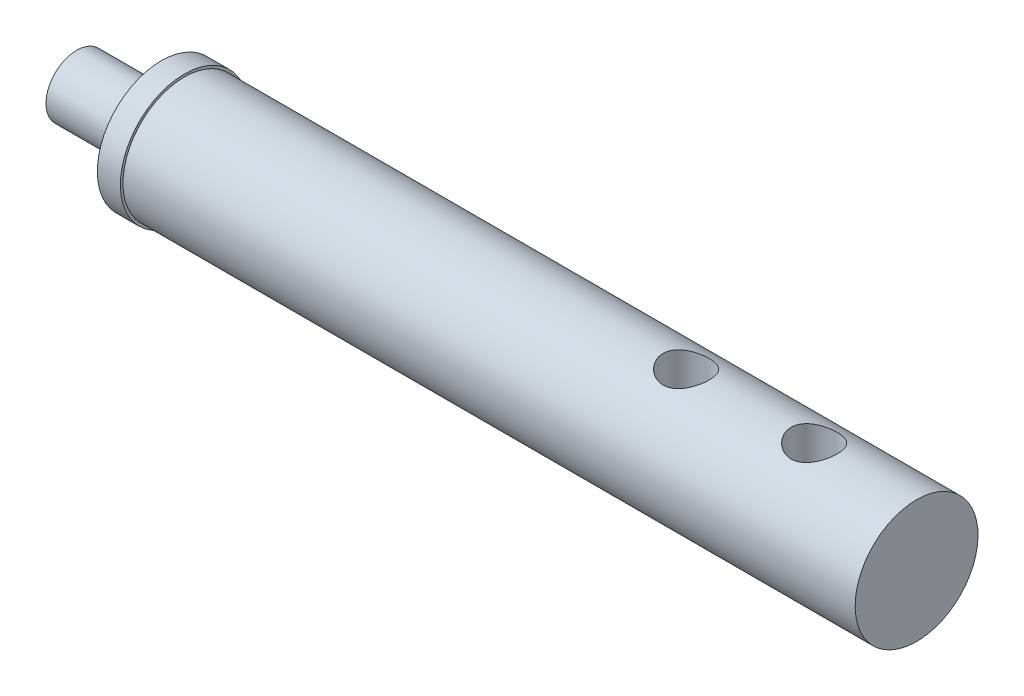
ISO-10303-21;
HEADER;
FILE_DESCRIPTION(('STEP AP214'),'2;1');
FILE_NAME('part.step','',(''),(''),'','','');
FILE_SCHEMA(('AUTOMOTIVE_DESIGN { 1 0 10303 214 1 1 1 1 }'));
ENDSEC;
DATA;
#1=APPLICATION_CONTEXT('core data for automotive mechanical design processes');
#2=APPLICATION_PROTOCOL_DEFINITION('international standard','automotive_design',2000,#1);
#3=PRODUCT_CONTEXT('',#1,'mechanical');
#4=PRODUCT('Part','Part','',(#3));
#5=PRODUCT_RELATED_PRODUCT_CATEGORY('part','',(#4));
#6=PRODUCT_DEFINITION_FORMATION('','',#4);
#7=PRODUCT_DEFINITION_CONTEXT('part definition',#1,'design');
#8=PRODUCT_DEFINITION('design','',#6,#7);
#9=PRODUCT_DEFINITION_SHAPE('','',#8);
#10=(LENGTH_UNIT() NAMED_UNIT(*) SI_UNIT(.MILLI.,.METRE.));
#11=(NAMED_UNIT(*) PLANE_ANGLE_UNIT() SI_UNIT($,.RADIAN.));
#12=(NAMED_UNIT(*) SI_UNIT($,.STERADIAN.) SOLID_ANGLE_UNIT());
#13=UNCERTAINTY_MEASURE_WITH_UNIT(LENGTH_MEASURE(1.E-05),#10,'distance_accuracy_value','');
#14=(GEOMETRIC_REPRESENTATION_CONTEXT(3) GLOBAL_UNCERTAINTY_ASSIGNED_CONTEXT((#13)) GLOBAL_UNIT_ASSIGNED_CONTEXT((#10,
#11,#12)) REPRESENTATION_CONTEXT('',''));
#15=CARTESIAN_POINT('',(0.,0.,0.));
#16=DIRECTION('',(0.,0.,1.));
#17=DIRECTION('',(1.,0.,0.));
#18=AXIS2_PLACEMENT_3D('',#15,#16,#17);
#19=CARTESIAN_POINT('',(108.677085229247,0.,0.));
#20=DIRECTION('',(1.,0.,0.));
#21=DIRECTION('',(0.,1.,0.));
#22=AXIS2_PLACEMENT_3D('',#19,#20,#21);
#23=PLANE('',#22);
#24=CARTESIAN_POINT('',(108.677085229247,0.,0.));
#25=DIRECTION('',(1.,0.,0.));
#26=DIRECTION('',(0.,1.,0.));
#27=AXIS2_PLACEMENT_3D('',#24,#25,#26);
#28=CIRCLE('',#27,12.);
#29=CARTESIAN_POINT('',(108.677085229247,12.,0.));
#30=VERTEX_POINT('',#29);
#31=EDGE_CURVE('E10',#30,#30,#28,.T.);
#32=ORIENTED_EDGE('',*,*,#31,.T.);
#33=EDGE_LOOP('',(#32));
#34=FACE_BOUND('',#33,.T.);
#35=ADVANCED_FACE('F33',(#34),#23,.T.);
#36=CARTESIAN_POINT('',(108.677085229247,0.,0.));
#37=DIRECTION('',(1.,0.,0.));
#38=DIRECTION('',(0.,1.,0.));
#39=AXIS2_PLACEMENT_3D('',#36,#37,#38);
#40=CYLINDRICAL_SURFACE('',#39,12.);
#41=CARTESIAN_POINT('',(84.1770852292475,12.,0.));
#42=CARTESIAN_POINT('',(84.1770846666589,12.0000004149463,0.121821920216143));
#43=CARTESIAN_POINT('',(84.1820358647094,11.9981409348073,0.243636002691336));
#44=CARTESIAN_POINT('',(84.2017913173601,11.990753547771,0.486392423781215));
#45=CARTESIAN_POINT('',(84.2165987219613,11.9852244680872,0.607334471202251));
#46=CARTESIAN_POINT('',(84.255910815812,11.970649565472,0.847347381687187));
#47=CARTESIAN_POINT('',(84.2804103467286,11.9616056132673,0.966419205128135));
#48=CARTESIAN_POINT('',(84.3388794686573,11.9402382455255,1.2019581040135));
#49=CARTESIAN_POINT('',(84.3728527388007,11.9279135559973,1.31842414848255));
#50=CARTESIAN_POINT('',(84.4498703792966,11.9003384511568,1.54765442429004));
#51=CARTESIAN_POINT('',(84.4928931782499,11.8850950009216,1.66042673449101));
#52=CARTESIAN_POINT('',(84.587691264291,11.8520536393113,1.8818570560588));
#53=CARTESIAN_POINT('',(84.6394697967652,11.8342547811235,1.99051352350809));
#54=CARTESIAN_POINT('',(84.807353634791,11.7776768093622,2.30927279411985));
#55=CARTESIAN_POINT('',(84.9360670253792,11.7356939966761,2.51234231941558));
#56=CARTESIAN_POINT('',(85.2289285958481,11.6455850212357,2.90206977477989));
#57=CARTESIAN_POINT('',(85.3942447512558,11.5972851945296,3.08780172063124));
#58=CARTESIAN_POINT('',(85.7533478075454,11.500801507554,3.42974311725174));
#59=CARTESIAN_POINT('',(85.9471433908212,11.4526176872201,3.58594353155376));
#60=CARTESIAN_POINT('',(86.2595261584191,11.3834841407686,3.79764477617943));
#61=CARTESIAN_POINT('',(86.3695226129936,11.3605705131175,3.86547493196533));
#62=CARTESIAN_POINT('',(86.5952537172002,11.3168804194774,3.99157408188853));
#63=CARTESIAN_POINT('',(86.7109860415758,11.2961030977882,4.04984690983613));
#64=CARTESIAN_POINT('',(86.9474509866362,11.257354412399,4.15634309619241));
#65=CARTESIAN_POINT('',(87.0681841903026,11.2393833770156,4.20456527896395));
#66=CARTESIAN_POINT('',(87.3137342752707,11.2068698048304,4.29047551547082));
#67=CARTESIAN_POINT('',(87.4385491542987,11.1923256148824,4.32816865016452));
#68=CARTESIAN_POINT('',(87.6862209467612,11.167687799886,4.39133833063888));
#69=CARTESIAN_POINT('',(87.8089516546886,11.1574374723367,4.41724869222399));
#70=CARTESIAN_POINT('',(88.0563603436103,11.1409189584307,4.45874705417234));
#71=CARTESIAN_POINT('',(88.1810374485606,11.1346490306496,4.4743395687192));
#72=CARTESIAN_POINT('',(88.4313813249436,11.1263077224061,4.4950419282572));
#73=CARTESIAN_POINT('',(88.5570479454543,11.124235713664,4.50015334189903));
#74=CARTESIAN_POINT('',(88.8083613306208,11.124362586323,4.49983964081548));
#75=CARTESIAN_POINT('',(88.9340080958579,11.1265613020677,4.49441493477358));
#76=CARTESIAN_POINT('',(89.1767396457381,11.1348931002806,4.4737313818125));
#77=CARTESIAN_POINT('',(89.2938850540955,11.1407817124042,4.4590833434736));
#78=CARTESIAN_POINT('',(89.5264534934787,11.1560711786316,4.42068867776496));
#79=CARTESIAN_POINT('',(89.6418759391447,11.1654731993557,4.39693902815623));
#80=CARTESIAN_POINT('',(89.984314246136,11.1985472030748,4.31234407385654));
#81=CARTESIAN_POINT('',(90.2077139490268,11.2270952052095,4.23813423625875));
#82=CARTESIAN_POINT('',(90.6429529098014,11.294571324263,4.05490721343477));
#83=CARTESIAN_POINT('',(90.854493484467,11.3336856090865,3.94525805379046));
#84=CARTESIAN_POINT('',(91.2569126417782,11.417826234714,3.6946836216903));
#85=CARTESIAN_POINT('',(91.4477840566549,11.4628546145386,3.55374755073012));
#86=CARTESIAN_POINT('',(91.8168991071582,11.5574411862383,3.23345300799872));
#87=CARTESIAN_POINT('',(91.9934319255671,11.607100429164,3.05214885027355));
#88=CARTESIAN_POINT('',(92.3140983536707,11.7027518394278,2.66193788370925));
#89=CARTESIAN_POINT('',(92.4582269838947,11.748743442469,2.45302684040981));
#90=CARTESIAN_POINT('',(92.7118766328393,11.8327918458052,2.00917028059688));
#91=CARTESIAN_POINT('',(92.8208280307739,11.8707149483013,1.77387213379261));
#92=CARTESIAN_POINT('',(92.9970329842201,11.9333615492963,1.28651055931184));
#93=CARTESIAN_POINT('',(93.0643050598478,11.9580909097264,1.03445463312944));
#94=CARTESIAN_POINT('',(93.1519536099419,11.9905332973328,0.535125728885332));
#95=CARTESIAN_POINT('',(93.1746330668968,11.9990810722223,0.288310863440803));
#96=CARTESIAN_POINT('',(93.1791584024495,12.0007768095524,-0.2057174305182));
#97=CARTESIAN_POINT('',(93.1610133342757,11.9939281862917,-0.452930758520921));
#98=CARTESIAN_POINT('',(93.0861551560948,11.9661512982893,-0.930786126866774));
#99=CARTESIAN_POINT('',(93.0309507918936,11.9457741475744,-1.16169991458787));
#100=CARTESIAN_POINT('',(92.885526817723,11.8935442940438,-1.61082533431484));
#101=CARTESIAN_POINT('',(92.79530265361,11.8616900987367,-1.82903531000967));
#102=CARTESIAN_POINT('',(92.5795267349307,11.7884888040033,-2.25374302875422));
#103=CARTESIAN_POINT('',(92.4530148518034,11.7468902777666,-2.4597082422869));
#104=CARTESIAN_POINT('',(92.1693281084677,11.6587998753534,-2.8481791439392));
#105=CARTESIAN_POINT('',(92.0121419280239,11.6123061955644,-3.03067612982122));
#106=CARTESIAN_POINT('',(91.6608839758617,11.516200958323,-3.37808840855272));
#107=CARTESIAN_POINT('',(91.4652012754506,11.4665650100461,-3.54136933947526));
#108=CARTESIAN_POINT('',(91.0480884767801,11.372360357102,-3.83314678656077));
#109=CARTESIAN_POINT('',(90.826656069039,11.3277921076647,-3.96164017919753));
#110=CARTESIAN_POINT('',(90.4791624328501,11.2687303690453,-4.12541953452073));
#111=CARTESIAN_POINT('',(90.3604378996616,11.2503030894951,-4.17527938653556));
#112=CARTESIAN_POINT('',(90.1187613841315,11.2166905930926,-4.2647558541672));
#113=CARTESIAN_POINT('',(89.9958112254935,11.2015039975232,-4.30437682733459));
#114=CARTESIAN_POINT('',(89.7466187571431,11.1749073223601,-4.37296242168503));
#115=CARTESIAN_POINT('',(89.620377448834,11.163496108165,-4.40193024471252));
#116=CARTESIAN_POINT('',(89.3655670896572,11.1448585297206,-4.44890662829909));
#117=CARTESIAN_POINT('',(89.2369982017811,11.1376318736025,-4.46691595320736));
#118=CARTESIAN_POINT('',(88.9869468910608,11.1279568107625,-4.49096111754738));
#119=CARTESIAN_POINT('',(88.8655417134995,11.1252304971503,-4.49769375768258));
#120=CARTESIAN_POINT('',(88.6225169298441,11.1237678185175,-4.50131029580416));
#121=CARTESIAN_POINT('',(88.5008972652511,11.1250327991546,-4.49819087218449));
#122=CARTESIAN_POINT('',(88.2584734507649,11.131512007523,-4.48213280066957));
#123=CARTESIAN_POINT('',(88.1376689438313,11.1367243753675,-4.46919877710469));
#124=CARTESIAN_POINT('',(87.8976751281152,11.150924738849,-4.43364891145918));
#125=CARTESIAN_POINT('',(87.7784864449857,11.1599141561698,-4.41102942370236));
#126=CARTESIAN_POINT('',(87.5462737226528,11.1810458214159,-4.35718066722753));
#127=CARTESIAN_POINT('',(87.4331730899701,11.1930817833517,-4.32623979458418));
#128=CARTESIAN_POINT('',(87.2100289573492,11.220069483486,-4.2557559108144));
#129=CARTESIAN_POINT('',(87.0999865439142,11.23502224319,-4.21620988547497));
#130=CARTESIAN_POINT('',(86.7754897236352,11.2836374066331,-4.08512625929656));
#131=CARTESIAN_POINT('',(86.5664924120514,11.3210734609741,-3.98110253179985));
#132=CARTESIAN_POINT('',(86.1575753429247,11.4041928736043,-3.73655960136616));
#133=CARTESIAN_POINT('',(85.9587057154186,11.4502056852775,-3.59441315608529));
#134=CARTESIAN_POINT('',(85.5866476656644,11.5441926723435,-3.28000639093492));
#135=CARTESIAN_POINT('',(85.4134674379855,11.5921674673836,-3.10773650011228));
#136=CARTESIAN_POINT('',(85.1718393533,11.6632064644303,-2.82485495768735));
#137=CARTESIAN_POINT('',(85.0925612443134,11.6873329442322,-2.72355677041138));
#138=CARTESIAN_POINT('',(84.9428309077527,11.7341212355869,-2.51433251035988));
#139=CARTESIAN_POINT('',(84.8723754517559,11.7567835814237,-2.40640888366375));
#140=CARTESIAN_POINT('',(84.7407910951397,11.8000231112314,-2.18454509687346));
#141=CARTESIAN_POINT('',(84.6796671663781,11.8205991816831,-2.07060177268688));
#142=CARTESIAN_POINT('',(84.5673252356413,11.8590616275344,-1.83755175113715));
#143=CARTESIAN_POINT('',(84.5161030262077,11.8769491446375,-1.71844727331544));
#144=CARTESIAN_POINT('',(84.4219872644552,11.9102407175975,-1.47053797162899));
#145=CARTESIAN_POINT('',(84.3795583909248,11.9255011706843,-1.34153686175288));
#146=CARTESIAN_POINT('',(84.3064722661196,11.9520331999051,-1.07989915577461));
#147=CARTESIAN_POINT('',(84.2758098579,11.9633065233272,-0.947264179674937));
#148=CARTESIAN_POINT('',(84.2266001691643,11.9814979813589,-0.679492491904569));
#149=CARTESIAN_POINT('',(84.2080507499299,11.9884168847946,-0.544356226207061));
#150=CARTESIAN_POINT('',(84.1832942909703,11.9976674031164,-0.272809934790544));
#151=CARTESIAN_POINT('',(84.1770858591598,11.9999995353981,-0.136400054481796));
#152=CARTESIAN_POINT('',(84.1770852292475,12.,0.));
#153=B_SPLINE_CURVE_WITH_KNOTS('',3,(#41,#42,#43,#44,#45,#46,#47,#48,#49,#50,#51,#52,#53,#54,
#55,#56,#57,#58,#59,#60,#61,#62,#63,#64,#65,#66,#67,#68,#69,#70,#71,#72,#73,#74,#75,#76,#77,#78,
#79,#80,#81,#82,#83,#84,#85,#86,#87,#88,#89,#90,#91,#92,#93,#94,#95,#96,#97,#98,#99,#100,#101,
#102,#103,#104,#105,#106,#107,#108,#109,#110,#111,#112,#113,#114,#115,#116,#117,#118,#119,#120,
#121,#122,#123,#124,#125,#126,#127,#128,#129,#130,#131,#132,#133,#134,#135,#136,#137,#138,#139,
#140,#141,#142,#143,#144,#145,#146,#147,#148,#149,#150,#151,#152),.UNSPECIFIED.,.T.,.F.,(4,2,2,
2,2,2,2,2,2,2,2,2,2,2,2,2,2,2,2,2,2,2,2,2,2,2,2,2,2,2,2,2,2,2,2,2,2,2,2,2,2,2,2,2,2,2,2,2,2,2,2,
2,2,2,2,4),(0.,0.36533802450695,0.730792865566522,1.09605346575198,1.46145611308565,
1.82599742407275,2.19067415273862,2.91947018392637,3.67616860257936,4.43309819286654,
4.8264268137856,5.21959726757256,5.61281368524463,6.00584002102325,6.38291145568131,
6.75981780772968,7.13666774608802,7.51350306718044,7.86768402280121,8.22198268815951,
8.92994647641828,9.65130458621117,10.3729120569283,11.143016934675,11.9132400717526,
12.6953735931829,13.477159325566,14.2173829236784,14.9574423863162,15.6690654723158,
16.3807811322342,17.1134089903886,17.8463077351966,18.6217279182703,19.3972177022048,
19.7870381951625,20.1766925107004,20.566229618268,20.9557395527224,21.3201489316713,
21.6846811837186,22.0490417862153,22.413539657309,22.7667469946613,23.1200782532195,
23.8262105801187,24.5693581369516,25.3127422403353,25.7049754844992,26.0970647789656,
26.4893622558026,26.881492668616,27.2908478409865,27.7000233978562,28.1091266894862,
28.5181838309153),.UNSPECIFIED.);
#154=CARTESIAN_POINT('',(84.1770852292475,12.,0.));
#155=VERTEX_POINT('',#154);
#156=EDGE_CURVE('E36',#155,#155,#153,.T.);
#157=ORIENTED_EDGE('',*,*,#156,.F.);
#158=EDGE_LOOP('',(#157));
#159=FACE_BOUND('',#158,.T.);
#160=CARTESIAN_POINT('',(88.6770852292475,-11.1242977306435,4.49999999999999));
#161=CARTESIAN_POINT('',(88.5556043790945,-11.1242972328958,4.50000051486866));
#162=CARTESIAN_POINT('',(88.4341312987894,-11.1262931123941,4.49507656344739));
#163=CARTESIAN_POINT('',(88.1920683954553,-11.1342087111622,4.47543393307325));
#164=CARTESIAN_POINT('',(88.0714788713279,-11.1401297014426,4.46071208140507));
#165=CARTESIAN_POINT('',(87.8321671996392,-11.1556999756688,4.4216287704631));
#166=CARTESIAN_POINT('',(87.7134442664983,-11.1653476449693,4.39727148579009));
#167=CARTESIAN_POINT('',(87.4786369752881,-11.1880554461943,4.339167733839));
#168=CARTESIAN_POINT('',(87.3625536815015,-11.2011169289245,4.30541754955758));
#169=CARTESIAN_POINT('',(87.0201055963718,-11.244759464982,4.19072103949293));
#170=CARTESIAN_POINT('',(86.7986983725318,-11.2798579603423,4.09618882137095));
#171=CARTESIAN_POINT('',(86.3749302137349,-11.3580953533323,3.87394729637414));
#172=CARTESIAN_POINT('',(86.1725750245819,-11.4012366649375,3.74622802417441));
#173=CARTESIAN_POINT('',(85.7824255342208,-11.4931068606514,3.45440224379134));
#174=CARTESIAN_POINT('',(85.5957026556954,-11.5420001559471,3.28891208094076));
#175=CARTESIAN_POINT('',(85.2519137692546,-11.6384926206391,2.92918687465789));
#176=CARTESIAN_POINT('',(85.0948540874544,-11.6860915121359,2.73494571537004));
#177=CARTESIAN_POINT('',(84.8096675408499,-11.7765861894619,2.31508414690118));
#178=CARTESIAN_POINT('',(84.6827070320791,-11.8192668290451,2.08862089113191));
#179=CARTESIAN_POINT('',(84.4691314847724,-11.8931402468728,1.61566726739477));
#180=CARTESIAN_POINT('',(84.3825024537277,-11.9243370085197,1.36918388007284));
#181=CARTESIAN_POINT('',(84.2558115988992,-11.9705609111804,0.87446803720928));
#182=CARTESIAN_POINT('',(84.2139023621646,-11.9862274559289,0.626769595102087));
#183=CARTESIAN_POINT('',(84.171921611179,-12.0019204237524,0.127393088128116));
#184=CARTESIAN_POINT('',(84.1718364924057,-12.0019519325818,-0.12428365604048));
#185=CARTESIAN_POINT('',(84.2124305174315,-11.9867779769887,-0.611230628383599));
#186=CARTESIAN_POINT('',(84.2510931241095,-11.9723262598653,-0.846696534583528));
#187=CARTESIAN_POINT('',(84.3646929739085,-11.9307982480031,-1.30751765417036));
#188=CARTESIAN_POINT('',(84.43963278576,-11.9037210592799,-1.53287215034972));
#189=CARTESIAN_POINT('',(84.6245965845526,-11.8391330750131,-1.97096705184962));
#190=CARTESIAN_POINT('',(84.7351152451258,-11.801476184087,-2.183476176845));
#191=CARTESIAN_POINT('',(84.9876615199625,-11.7195393067737,-2.5874598238896));
#192=CARTESIAN_POINT('',(85.1296992982855,-11.6752571854336,-2.77892753080496));
#193=CARTESIAN_POINT('',(85.4509670881127,-11.5815758896233,-3.14727146039434));
#194=CARTESIAN_POINT('',(85.6318869761813,-11.5320289127229,-3.32263843577455));
#195=CARTESIAN_POINT('',(86.0208642092297,-11.4354738195653,-3.64111186709615));
#196=CARTESIAN_POINT('',(86.2289283490931,-11.3884663431889,-3.78421022084207));
#197=CARTESIAN_POINT('',(86.6722436315652,-11.3013811042672,-4.03696835419777));
#198=CARTESIAN_POINT('',(86.9079957100051,-11.2614803117135,-4.14581543536005));
#199=CARTESIAN_POINT('',(87.3963739044387,-11.1951731560847,-4.3216939330478));
#200=CARTESIAN_POINT('',(87.648990543936,-11.1687592854473,-4.38874861811552));
#201=CARTESIAN_POINT('',(88.1490131162608,-11.1341879173731,-4.47570575133563));
#202=CARTESIAN_POINT('',(88.3959375458733,-11.12510355743,-4.49800563478112));
#203=CARTESIAN_POINT('',(88.8901132994553,-11.1235961855666,-4.501736569076));
#204=CARTESIAN_POINT('',(89.1373645263007,-11.1311690100715,-4.48317783280982));
#205=CARTESIAN_POINT('',(89.6128749961146,-11.1611814489379,-4.40789200560757));
#206=CARTESIAN_POINT('',(89.8414786365414,-11.1828982865056,-4.35301855002693));
#207=CARTESIAN_POINT('',(90.2861290634082,-11.2378946113787,-4.2089932392189));
#208=CARTESIAN_POINT('',(90.5021732667562,-11.2711764675025,-4.11983436104071));
#209=CARTESIAN_POINT('',(90.9245785434717,-11.3470872934852,-3.90600876825621));
#210=CARTESIAN_POINT('',(91.1302731056415,-11.3900198667602,-3.78013635530255));
#211=CARTESIAN_POINT('',(91.5184721744437,-11.4798844288305,-3.4977395358832));
#212=CARTESIAN_POINT('',(91.7009681531893,-11.5268178778321,-3.34120391092628));
#213=CARTESIAN_POINT('',(92.0495903487606,-11.6229913965851,-2.99018202266745));
#214=CARTESIAN_POINT('',(92.2139454552764,-11.67218908067,-2.79391902433725));
#215=CARTESIAN_POINT('',(92.5076003322932,-11.7644962489399,-2.37539241539538));
#216=CARTESIAN_POINT('',(92.6368999891222,-11.807605713383,-2.15312872047637));
#217=CARTESIAN_POINT('',(92.8559233968127,-11.882849570984,-1.68904898789882));
#218=CARTESIAN_POINT('',(92.9457825967735,-11.9150214395717,-1.44730329730598));
#219=CARTESIAN_POINT('',(93.0830544746472,-11.9648831019454,-0.950645664456751));
#220=CARTESIAN_POINT('',(93.1304870998783,-11.9825797011027,-0.695739969210863));
#221=CARTESIAN_POINT('',(93.1794084239854,-12.0008522175155,-0.196006749191646));
#222=CARTESIAN_POINT('',(93.1834136293093,-12.0023658213628,0.0485423282554951));
#223=CARTESIAN_POINT('',(93.1518398000205,-11.9905467015259,0.534680335167223));
#224=CARTESIAN_POINT('',(93.1162655394917,-11.9772157683929,0.776269618089571));
#225=CARTESIAN_POINT('',(93.0083084963268,-11.9376326617728,1.2436448325906));
#226=CARTESIAN_POINT('',(92.936844853302,-11.9117036441642,1.46967251586619));
#227=CARTESIAN_POINT('',(92.7600558475295,-11.8496336058244,1.90654609629838));
#228=CARTESIAN_POINT('',(92.6547240748157,-11.8134906521352,2.1173891103136));
#229=CARTESIAN_POINT('',(92.408140840031,-11.7327181713002,2.52762178508753));
#230=CARTESIAN_POINT('',(92.2655655727351,-11.6877957662403,2.72615741797057));
#231=CARTESIAN_POINT('',(91.9506714771354,-11.5949866683837,3.09724726943399));
#232=CARTESIAN_POINT('',(91.7783420320587,-11.5470989214303,3.26979217281129));
#233=CARTESIAN_POINT('',(91.3978545129118,-11.4506382353735,3.59345520966895));
#234=CARTESIAN_POINT('',(91.1882854856055,-11.4021625294342,3.74296181718829));
#235=CARTESIAN_POINT('',(90.8564361718651,-11.3352443002644,3.93916546426689));
#236=CARTESIAN_POINT('',(90.742826150075,-11.3138924119309,3.99992025047125));
#237=CARTESIAN_POINT('',(90.5104562211858,-11.273782848917,4.11161020403325));
#238=CARTESIAN_POINT('',(90.391698539956,-11.2550240673794,4.16254956474638));
#239=CARTESIAN_POINT('',(90.1444488611835,-11.2199608933438,4.25618289786881));
#240=CARTESIAN_POINT('',(90.0157588381115,-11.2038027773365,4.29840935950535));
#241=CARTESIAN_POINT('',(89.7547256255342,-11.1756202127792,4.37115963992764));
#242=CARTESIAN_POINT('',(89.6223841068396,-11.163593906448,4.40168871890875));
#243=CARTESIAN_POINT('',(89.3551927352085,-11.1441502260957,4.45068676541731));
#244=CARTESIAN_POINT('',(89.2203436805032,-11.1367314103777,4.46915950549961));
#245=CARTESIAN_POINT('',(88.949354805972,-11.1268057292739,4.49381511438351));
#246=CARTESIAN_POINT('',(88.8132151392481,-11.1242982884133,4.49999942304464));
#247=CARTESIAN_POINT('',(88.6770852292475,-11.1242977306435,4.49999999999999));
#248=B_SPLINE_CURVE_WITH_KNOTS('',3,(#160,#161,#162,#163,#164,#165,#166,#167,#168,#169,#170,
#171,#172,#173,#174,#175,#176,#177,#178,#179,#180,#181,#182,#183,#184,#185,#186,#187,#188,#189,
#190,#191,#192,#193,#194,#195,#196,#197,#198,#199,#200,#201,#202,#203,#204,#205,#206,#207,#208,
#209,#210,#211,#212,#213,#214,#215,#216,#217,#218,#219,#220,#221,#222,#223,#224,#225,#226,#227,
#228,#229,#230,#231,#232,#233,#234,#235,#236,#237,#238,#239,#240,#241,#242,#243,#244,#245,#246,
#247),.UNSPECIFIED.,.T.,.F.,(4,2,2,2,2,2,2,2,2,2,2,2,2,2,2,2,2,2,2,2,2,2,2,2,2,2,2,2,2,2,2,2,2,
2,2,2,2,2,2,2,2,2,2,4),(0.,0.364312890801975,0.728743809325302,1.0930170089067,1.45743456590096,
2.1837286923755,2.91024116115319,3.66958869413822,4.42909798679386,5.21445128619701,
5.99953191354428,6.75074967679475,7.5017230842501,8.2155433062002,8.92941408000443,
9.65367305842441,10.3781659309736,11.1450493740806,11.9121251569244,12.6962268897519,
13.4798916712983,14.2203188544486,14.9605609839006,15.66566450008,16.3709125251198,
17.1025959524087,17.8345475762247,18.6128996320427,19.3912542117394,20.1669143889391,
20.9422096890378,21.6723207387321,22.4023437318184,23.1145573423507,23.8269058276189,
24.5691988325436,25.3117572490829,26.0935071084964,26.4848788226902,26.8760829621587,
27.2846870621149,27.6931072006589,28.1013994789094,28.5096439139333),.UNSPECIFIED.);
#249=CARTESIAN_POINT('',(88.6770852292475,-11.1242977306435,4.49999999999999));
#250=VERTEX_POINT('',#249);
#251=EDGE_CURVE('E134',#250,#250,#248,.T.);
#252=ORIENTED_EDGE('',*,*,#251,.F.);
#253=EDGE_LOOP('',(#252));
#254=FACE_BOUND('',#253,.T.);
#255=CARTESIAN_POINT('',(59.1770852292475,12.,0.));
#256=CARTESIAN_POINT('',(59.1770846666589,12.0000004149463,0.121821920216143));
#257=CARTESIAN_POINT('',(59.1820358647094,11.9981409348073,0.243636002691336));
#258=CARTESIAN_POINT('',(59.2017913173601,11.990753547771,0.486392423781215));
#259=CARTESIAN_POINT('',(59.2165987219613,11.9852244680872,0.607334471202252));
#260=CARTESIAN_POINT('',(59.255910815812,11.970649565472,0.847347381687187));
#261=CARTESIAN_POINT('',(59.2804103467286,11.9616056132673,0.966419205128133));
#262=CARTESIAN_POINT('',(59.3388794686573,11.9402382455255,1.2019581040135));
#263=CARTESIAN_POINT('',(59.3728527388007,11.9279135559973,1.31842414848255));
#264=CARTESIAN_POINT('',(59.4498703792966,11.9003384511568,1.54765442429004));
#265=CARTESIAN_POINT('',(59.4928931782499,11.8850950009216,1.66042673449101));
#266=CARTESIAN_POINT('',(59.587691264291,11.8520536393113,1.88185705605879));
#267=CARTESIAN_POINT('',(59.6394697967652,11.8342547811235,1.99051352350808));
#268=CARTESIAN_POINT('',(59.8073536347909,11.7776768093622,2.30927279411985));
#269=CARTESIAN_POINT('',(59.9360670253791,11.7356939966761,2.51234231941558));
#270=CARTESIAN_POINT('',(60.2289285958481,11.6455850212357,2.90206977477989));
#271=CARTESIAN_POINT('',(60.3942447512557,11.5972851945296,3.08780172063125));
#272=CARTESIAN_POINT('',(60.7533478075454,11.5008015075539,3.42974311725175));
#273=CARTESIAN_POINT('',(60.9471433908212,11.4526176872201,3.58594353155377));
#274=CARTESIAN_POINT('',(61.2595261584191,11.3834841407686,3.79764477617944));
#275=CARTESIAN_POINT('',(61.3695226129936,11.3605705131175,3.86547493196535));
#276=CARTESIAN_POINT('',(61.5952537172002,11.3168804194774,3.99157408188854));
#277=CARTESIAN_POINT('',(61.7109860415758,11.2961030977882,4.04984690983615));
#278=CARTESIAN_POINT('',(61.9474509866362,11.257354412399,4.15634309619243));
#279=CARTESIAN_POINT('',(62.0681841903026,11.2393833770156,4.20456527896396));
#280=CARTESIAN_POINT('',(62.3137342752707,11.2068698048304,4.29047551547084));
#281=CARTESIAN_POINT('',(62.4385491542987,11.1923256148824,4.32816865016453));
#282=CARTESIAN_POINT('',(62.6862209467612,11.167687799886,4.39133833063889));
#283=CARTESIAN_POINT('',(62.8089516546886,11.1574374723367,4.417248692224));
#284=CARTESIAN_POINT('',(63.0563603436103,11.1409189584307,4.45874705417235));
#285=CARTESIAN_POINT('',(63.1810374485606,11.1346490306496,4.47433956871922));
#286=CARTESIAN_POINT('',(63.4313813249437,11.1263077224061,4.49504192825721));
#287=CARTESIAN_POINT('',(63.5570479454543,11.124235713664,4.50015334189904));
#288=CARTESIAN_POINT('',(63.8083613306208,11.124362586323,4.4998396408155));
#289=CARTESIAN_POINT('',(63.9340080958579,11.1265613020677,4.49441493477359));
#290=CARTESIAN_POINT('',(64.1767396457381,11.1348931002806,4.47373138181252));
#291=CARTESIAN_POINT('',(64.2938850540955,11.1407817124042,4.45908334347361));
#292=CARTESIAN_POINT('',(64.5264534934787,11.1560711786316,4.42068867776497));
#293=CARTESIAN_POINT('',(64.6418759391447,11.1654731993557,4.39693902815624));
#294=CARTESIAN_POINT('',(64.984314246136,11.1985472030748,4.31234407385655));
#295=CARTESIAN_POINT('',(65.2077139490268,11.2270952052094,4.23813423625877));
#296=CARTESIAN_POINT('',(65.6429529098014,11.294571324263,4.05490721343478));
#297=CARTESIAN_POINT('',(65.854493484467,11.3336856090865,3.94525805379048));
#298=CARTESIAN_POINT('',(66.2569126417782,11.417826234714,3.69468362169032));
#299=CARTESIAN_POINT('',(66.4477840566549,11.4628546145386,3.55374755073014));
#300=CARTESIAN_POINT('',(66.8168991071582,11.5574411862383,3.23345300799872));
#301=CARTESIAN_POINT('',(66.9934319255671,11.607100429164,3.05214885027356));
#302=CARTESIAN_POINT('',(67.3140983536707,11.7027518394278,2.66193788370926));
#303=CARTESIAN_POINT('',(67.4582269838948,11.748743442469,2.45302684040983));
#304=CARTESIAN_POINT('',(67.7118766328393,11.8327918458052,2.00917028059689));
#305=CARTESIAN_POINT('',(67.8208280307739,11.8707149483013,1.77387213379262));
#306=CARTESIAN_POINT('',(67.9970329842202,11.9333615492963,1.28651055931184));
#307=CARTESIAN_POINT('',(68.0643050598478,11.9580909097264,1.03445463312944));
#308=CARTESIAN_POINT('',(68.1519536099419,11.9905332973328,0.535125728885337));
#309=CARTESIAN_POINT('',(68.1746330668968,11.9990810722223,0.288310863440808));
#310=CARTESIAN_POINT('',(68.1791584024495,12.0007768095524,-0.205717430518194));
#311=CARTESIAN_POINT('',(68.1610133342758,11.9939281862917,-0.452930758520915));
#312=CARTESIAN_POINT('',(68.0861551560948,11.9661512982893,-0.930786126866769));
#313=CARTESIAN_POINT('',(68.0309507918936,11.9457741475744,-1.16169991458786));
#314=CARTESIAN_POINT('',(67.885526817723,11.8935442940438,-1.61082533431484));
#315=CARTESIAN_POINT('',(67.79530265361,11.8616900987367,-1.82903531000967));
#316=CARTESIAN_POINT('',(67.5795267349308,11.7884888040033,-2.25374302875422));
#317=CARTESIAN_POINT('',(67.4530148518034,11.7468902777666,-2.4597082422869));
#318=CARTESIAN_POINT('',(67.1693281084677,11.6587998753534,-2.8481791439392));
#319=CARTESIAN_POINT('',(67.0121419280239,11.6123061955644,-3.03067612982122));
#320=CARTESIAN_POINT('',(66.6608839758617,11.5162009583229,-3.37808840855273));
#321=CARTESIAN_POINT('',(66.4652012754507,11.4665650100461,-3.54136933947527));
#322=CARTESIAN_POINT('',(66.0480884767801,11.372360357102,-3.83314678656079));
#323=CARTESIAN_POINT('',(65.826656069039,11.3277921076647,-3.96164017919754));
#324=CARTESIAN_POINT('',(65.4791624328501,11.2687303690453,-4.12541953452074));
#325=CARTESIAN_POINT('',(65.3604378996617,11.2503030894951,-4.17527938653557));
#326=CARTESIAN_POINT('',(65.1187613841315,11.2166905930926,-4.26475585416721));
#327=CARTESIAN_POINT('',(64.9958112254935,11.2015039975232,-4.3043768273346));
#328=CARTESIAN_POINT('',(64.7466187571431,11.1749073223601,-4.37296242168504));
#329=CARTESIAN_POINT('',(64.6203774488341,11.163496108165,-4.40193024471253));
#330=CARTESIAN_POINT('',(64.3655670896572,11.1448585297206,-4.4489066282991));
#331=CARTESIAN_POINT('',(64.2369982017811,11.1376318736025,-4.46691595320737));
#332=CARTESIAN_POINT('',(63.9869468910609,11.1279568107625,-4.49096111754739));
#333=CARTESIAN_POINT('',(63.8655417134995,11.1252304971503,-4.49769375768259));
#334=CARTESIAN_POINT('',(63.6225169298441,11.1237678185175,-4.50131029580418));
#335=CARTESIAN_POINT('',(63.5008972652511,11.1250327991546,-4.4981908721845));
#336=CARTESIAN_POINT('',(63.2584734507649,11.131512007523,-4.48213280066958));
#337=CARTESIAN_POINT('',(63.1376689438314,11.1367243753675,-4.46919877710471));
#338=CARTESIAN_POINT('',(62.8976751281152,11.150924738849,-4.4336489114592));
#339=CARTESIAN_POINT('',(62.7784864449857,11.1599141561698,-4.41102942370238));
#340=CARTESIAN_POINT('',(62.5462737226528,11.1810458214159,-4.35718066722755));
#341=CARTESIAN_POINT('',(62.4331730899701,11.1930817833517,-4.32623979458419));
#342=CARTESIAN_POINT('',(62.2100289573492,11.220069483486,-4.25575591081442));
#343=CARTESIAN_POINT('',(62.0999865439142,11.23502224319,-4.21620988547498));
#344=CARTESIAN_POINT('',(61.7754897236352,11.2836374066331,-4.08512625929658));
#345=CARTESIAN_POINT('',(61.5664924120514,11.3210734609741,-3.98110253179987));
#346=CARTESIAN_POINT('',(61.1575753429248,11.4041928736043,-3.73655960136618));
#347=CARTESIAN_POINT('',(60.9587057154186,11.4502056852775,-3.59441315608531));
#348=CARTESIAN_POINT('',(60.5866476656644,11.5441926723435,-3.28000639093494));
#349=CARTESIAN_POINT('',(60.4134674379856,11.5921674673836,-3.1077365001123));
#350=CARTESIAN_POINT('',(60.1718393533,11.6632064644303,-2.82485495768738));
#351=CARTESIAN_POINT('',(60.0925612443134,11.6873329442322,-2.7235567704114));
#352=CARTESIAN_POINT('',(59.9428309077527,11.7341212355869,-2.5143325103599));
#353=CARTESIAN_POINT('',(59.8723754517559,11.7567835814237,-2.40640888366377));
#354=CARTESIAN_POINT('',(59.7407910951397,11.8000231112313,-2.18454509687348));
#355=CARTESIAN_POINT('',(59.6796671663781,11.820599181683,-2.0706017726869));
#356=CARTESIAN_POINT('',(59.5673252356413,11.8590616275344,-1.83755175113717));
#357=CARTESIAN_POINT('',(59.5161030262077,11.8769491446375,-1.71844727331546));
#358=CARTESIAN_POINT('',(59.4219872644552,11.9102407175975,-1.47053797162901));
#359=CARTESIAN_POINT('',(59.3795583909248,11.9255011706843,-1.3415368617529));
#360=CARTESIAN_POINT('',(59.3064722661195,11.9520331999051,-1.07989915577462));
#361=CARTESIAN_POINT('',(59.2758098579,11.9633065233272,-0.947264179674947));
#362=CARTESIAN_POINT('',(59.2266001691643,11.9814979813589,-0.679492491904576));
#363=CARTESIAN_POINT('',(59.2080507499299,11.9884168847946,-0.544356226207066));
#364=CARTESIAN_POINT('',(59.1832942909703,11.9976674031164,-0.272809934790546));
#365=CARTESIAN_POINT('',(59.1770858591597,11.9999995353981,-0.136400054481797));
#366=CARTESIAN_POINT('',(59.1770852292475,12.,0.));
#367=B_SPLINE_CURVE_WITH_KNOTS('',3,(#255,#256,#257,#258,#259,#260,#261,#262,#263,#264,#265,
#266,#267,#268,#269,#270,#271,#272,#273,#274,#275,#276,#277,#278,#279,#280,#281,#282,#283,#284,
#285,#286,#287,#288,#289,#290,#291,#292,#293,#294,#295,#296,#297,#298,#299,#300,#301,#302,#303,
#304,#305,#306,#307,#308,#309,#310,#311,#312,#313,#314,#315,#316,#317,#318,#319,#320,#321,#322,
#323,#324,#325,#326,#327,#328,#329,#330,#331,#332,#333,#334,#335,#336,#337,#338,#339,#340,#341,
#342,#343,#344,#345,#346,#347,#348,#349,#350,#351,#352,#353,#354,#355,#356,#357,#358,#359,#360,
#361,#362,#363,#364,#365,#366),.UNSPECIFIED.,.T.,.F.,(4,2,2,2,2,2,2,2,2,2,2,2,2,2,2,2,2,2,2,2,2,
2,2,2,2,2,2,2,2,2,2,2,2,2,2,2,2,2,2,2,2,2,2,2,2,2,2,2,2,2,2,2,2,2,2,4),(0.,0.365338024506951,
0.730792865566523,1.09605346575198,1.46145611308565,1.82599742407275,2.19067415273862,
2.91947018392637,3.67616860257937,4.43309819286655,4.82642681378563,5.21959726757258,
5.61281368524465,6.00584002102326,6.38291145568134,6.75981780772971,7.13666774608806,
7.51350306718048,7.86768402280122,8.22198268815953,8.9299464764183,9.65130458621118,
10.3729120569284,11.143016934675,11.9132400717526,12.6953735931829,13.477159325566,
14.2173829236784,14.9574423863163,15.6690654723158,16.3807811322342,17.1134089903886,
17.8463077351967,18.6217279182704,19.3972177022049,19.7870381951625,20.1766925107004,
20.566229618268,20.9557395527224,21.3201489316713,21.6846811837186,22.0490417862153,
22.4135396573091,22.7667469946614,23.1200782532196,23.8262105801187,24.5693581369517,
25.3127422403354,25.7049754844992,26.0970647789656,26.4893622558027,26.8814926686161,
27.2908478409866,27.7000233978562,28.1091266894863,28.5181838309154),.UNSPECIFIED.);
#368=CARTESIAN_POINT('',(59.1770852292475,12.,0.));
#369=VERTEX_POINT('',#368);
#370=EDGE_CURVE('E60',#369,#369,#367,.T.);
#371=ORIENTED_EDGE('',*,*,#370,.F.);
#372=EDGE_LOOP('',(#371));
#373=FACE_BOUND('',#372,.T.);
#374=CARTESIAN_POINT('',(63.6770852292475,-11.1242977306435,4.5));
#375=CARTESIAN_POINT('',(63.5556043790945,-11.1242972328958,4.50000051486868));
#376=CARTESIAN_POINT('',(63.4341312987894,-11.1262931123941,4.4950765634474));
#377=CARTESIAN_POINT('',(63.1920683954553,-11.1342087111622,4.47543393307327));
#378=CARTESIAN_POINT('',(63.0714788713279,-11.1401297014426,4.46071208140508));
#379=CARTESIAN_POINT('',(62.8321671996392,-11.1556999756688,4.42162877046312));
#380=CARTESIAN_POINT('',(62.7134442664984,-11.1653476449693,4.39727148579011));
#381=CARTESIAN_POINT('',(62.4786369752881,-11.1880554461943,4.33916773383902));
#382=CARTESIAN_POINT('',(62.3625536815015,-11.2011169289245,4.3054175495576));
#383=CARTESIAN_POINT('',(62.0201055963719,-11.244759464982,4.19072103949295));
#384=CARTESIAN_POINT('',(61.7986983725318,-11.2798579603423,4.09618882137096));
#385=CARTESIAN_POINT('',(61.3749302137349,-11.3580953533323,3.87394729637416));
#386=CARTESIAN_POINT('',(61.1725750245819,-11.4012366649375,3.74622802417443));
#387=CARTESIAN_POINT('',(60.7824255342208,-11.4931068606514,3.45440224379135));
#388=CARTESIAN_POINT('',(60.5957026556954,-11.5420001559471,3.28891208094077));
#389=CARTESIAN_POINT('',(60.2519137692546,-11.6384926206391,2.9291868746579));
#390=CARTESIAN_POINT('',(60.0948540874543,-11.6860915121359,2.73494571537004));
#391=CARTESIAN_POINT('',(59.8096675408499,-11.7765861894619,2.31508414690118));
#392=CARTESIAN_POINT('',(59.6827070320791,-11.8192668290451,2.08862089113191));
#393=CARTESIAN_POINT('',(59.4691314847724,-11.8931402468728,1.61566726739477));
#394=CARTESIAN_POINT('',(59.3825024537277,-11.9243370085197,1.36918388007284));
#395=CARTESIAN_POINT('',(59.2558115988992,-11.9705609111804,0.874468037209287));
#396=CARTESIAN_POINT('',(59.2139023621646,-11.9862274559289,0.626769595102094));
#397=CARTESIAN_POINT('',(59.171921611179,-12.0019204237524,0.127393088128122));
#398=CARTESIAN_POINT('',(59.1718364924057,-12.0019519325818,-0.124283656040475));
#399=CARTESIAN_POINT('',(59.2124305174315,-11.9867779769887,-0.611230628383596));
#400=CARTESIAN_POINT('',(59.2510931241095,-11.9723262598653,-0.846696534583527));
#401=CARTESIAN_POINT('',(59.3646929739085,-11.9307982480031,-1.30751765417036));
#402=CARTESIAN_POINT('',(59.43963278576,-11.9037210592799,-1.53287215034972));
#403=CARTESIAN_POINT('',(59.6245965845526,-11.8391330750131,-1.97096705184963));
#404=CARTESIAN_POINT('',(59.7351152451258,-11.801476184087,-2.18347617684501));
#405=CARTESIAN_POINT('',(59.9876615199625,-11.7195393067737,-2.5874598238896));
#406=CARTESIAN_POINT('',(60.1296992982855,-11.6752571854336,-2.77892753080496));
#407=CARTESIAN_POINT('',(60.4509670881127,-11.5815758896233,-3.14727146039434));
#408=CARTESIAN_POINT('',(60.6318869761813,-11.5320289127229,-3.32263843577456));
#409=CARTESIAN_POINT('',(61.0208642092297,-11.4354738195653,-3.64111186709616));
#410=CARTESIAN_POINT('',(61.2289283490931,-11.3884663431889,-3.78421022084208));
#411=CARTESIAN_POINT('',(61.6722436315652,-11.3013811042672,-4.03696835419779));
#412=CARTESIAN_POINT('',(61.9079957100051,-11.2614803117135,-4.14581543536007));
#413=CARTESIAN_POINT('',(62.3963739044387,-11.1951731560847,-4.32169393304782));
#414=CARTESIAN_POINT('',(62.648990543936,-11.1687592854473,-4.38874861811554));
#415=CARTESIAN_POINT('',(63.1490131162608,-11.1341879173731,-4.47570575133565));
#416=CARTESIAN_POINT('',(63.3959375458733,-11.12510355743,-4.49800563478114));
#417=CARTESIAN_POINT('',(63.8901132994553,-11.1235961855666,-4.50173656907602));
#418=CARTESIAN_POINT('',(64.1373645263007,-11.1311690100715,-4.48317783280984));
#419=CARTESIAN_POINT('',(64.6128749961146,-11.1611814489379,-4.40789200560758));
#420=CARTESIAN_POINT('',(64.8414786365414,-11.1828982865056,-4.35301855002695));
#421=CARTESIAN_POINT('',(65.2861290634082,-11.2378946113787,-4.20899323921892));
#422=CARTESIAN_POINT('',(65.5021732667562,-11.2711764675025,-4.11983436104073));
#423=CARTESIAN_POINT('',(65.9245785434717,-11.3470872934852,-3.90600876825622));
#424=CARTESIAN_POINT('',(66.1302731056415,-11.3900198667602,-3.78013635530257));
#425=CARTESIAN_POINT('',(66.5184721744437,-11.4798844288305,-3.49773953588322));
#426=CARTESIAN_POINT('',(66.7009681531893,-11.5268178778321,-3.3412039109263));
#427=CARTESIAN_POINT('',(67.0495903487606,-11.6229913965851,-2.99018202266746));
#428=CARTESIAN_POINT('',(67.2139454552764,-11.67218908067,-2.79391902433726));
#429=CARTESIAN_POINT('',(67.5076003322932,-11.7644962489399,-2.37539241539539));
#430=CARTESIAN_POINT('',(67.6368999891222,-11.807605713383,-2.15312872047638));
#431=CARTESIAN_POINT('',(67.8559233968128,-11.882849570984,-1.68904898789884));
#432=CARTESIAN_POINT('',(67.9457825967735,-11.9150214395717,-1.447303297306));
#433=CARTESIAN_POINT('',(68.0830544746472,-11.9648831019454,-0.950645664456767));
#434=CARTESIAN_POINT('',(68.1304870998784,-11.9825797011027,-0.695739969210877));
#435=CARTESIAN_POINT('',(68.1794084239855,-12.0008522175155,-0.196006749191657));
#436=CARTESIAN_POINT('',(68.1834136293093,-12.0023658213628,0.0485423282554854));
#437=CARTESIAN_POINT('',(68.1518398000205,-11.9905467015259,0.534680335167217));
#438=CARTESIAN_POINT('',(68.1162655394917,-11.9772157683929,0.776269618089568));
#439=CARTESIAN_POINT('',(68.0083084963269,-11.9376326617728,1.2436448325906));
#440=CARTESIAN_POINT('',(67.936844853302,-11.9117036441642,1.46967251586619));
#441=CARTESIAN_POINT('',(67.7600558475295,-11.8496336058244,1.90654609629838));
#442=CARTESIAN_POINT('',(67.6547240748158,-11.8134906521352,2.11738911031361));
#443=CARTESIAN_POINT('',(67.4081408400311,-11.7327181713002,2.52762178508753));
#444=CARTESIAN_POINT('',(67.2655655727352,-11.6877957662403,2.72615741797058));
#445=CARTESIAN_POINT('',(66.9506714771354,-11.5949866683837,3.097247269434));
#446=CARTESIAN_POINT('',(66.7783420320587,-11.5470989214303,3.2697921728113));
#447=CARTESIAN_POINT('',(66.3978545129118,-11.4506382353735,3.59345520966896));
#448=CARTESIAN_POINT('',(66.1882854856055,-11.4021625294342,3.7429618171883));
#449=CARTESIAN_POINT('',(65.8564361718651,-11.3352443002644,3.9391654642669));
#450=CARTESIAN_POINT('',(65.742826150075,-11.3138924119309,3.99992025047125));
#451=CARTESIAN_POINT('',(65.5104562211859,-11.273782848917,4.11161020403326));
#452=CARTESIAN_POINT('',(65.391698539956,-11.2550240673794,4.16254956474639));
#453=CARTESIAN_POINT('',(65.1444488611835,-11.2199608933438,4.25618289786882));
#454=CARTESIAN_POINT('',(65.0157588381115,-11.2038027773364,4.29840935950536));
#455=CARTESIAN_POINT('',(64.7547256255342,-11.1756202127792,4.37115963992766));
#456=CARTESIAN_POINT('',(64.6223841068396,-11.163593906448,4.40168871890876));
#457=CARTESIAN_POINT('',(64.3551927352085,-11.1441502260957,4.45068676541733));
#458=CARTESIAN_POINT('',(64.2203436805032,-11.1367314103777,4.46915950549963));
#459=CARTESIAN_POINT('',(63.949354805972,-11.1268057292739,4.49381511438352));
#460=CARTESIAN_POINT('',(63.8132151392481,-11.1242982884133,4.49999942304466));
#461=CARTESIAN_POINT('',(63.6770852292475,-11.1242977306435,4.5));
#462=B_SPLINE_CURVE_WITH_KNOTS('',3,(#374,#375,#376,#377,#378,#379,#380,#381,#382,#383,#384,
#385,#386,#387,#388,#389,#390,#391,#392,#393,#394,#395,#396,#397,#398,#399,#400,#401,#402,#403,
#404,#405,#406,#407,#408,#409,#410,#411,#412,#413,#414,#415,#416,#417,#418,#419,#420,#421,#422,
#423,#424,#425,#426,#427,#428,#429,#430,#431,#432,#433,#434,#435,#436,#437,#438,#439,#440,#441,
#442,#443,#444,#445,#446,#447,#448,#449,#450,#451,#452,#453,#454,#455,#456,#457,#458,#459,#460,
#461),.UNSPECIFIED.,.T.,.F.,(4,2,2,2,2,2,2,2,2,2,2,2,2,2,2,2,2,2,2,2,2,2,2,2,2,2,2,2,2,2,2,2,2,
2,2,2,2,2,2,2,2,2,2,4),(0.,0.364312890801975,0.728743809325288,1.09301700890669,
1.45743456590096,2.18372869237549,2.9102411611532,3.66958869413823,4.42909798679388,
5.21445128619703,5.99953191354429,6.75074967679477,7.50172308425011,8.21554330620022,
8.92941408000446,9.65367305842443,10.3781659309737,11.1450493740806,11.9121251569244,
12.696226889752,13.4798916712983,14.2203188544486,14.9605609839006,15.66566450008,
16.3709125251199,17.1025959524087,17.8345475762247,18.6128996320428,19.3912542117394,
20.1669143889391,20.9422096890379,21.6723207387322,22.4023437318185,23.1145573423508,
23.826905827619,24.5691988325437,25.311757249083,26.0935071084965,26.4848788226903,
26.8760829621588,27.284687062115,27.693107200659,28.1013994789094,28.5096439139334),.UNSPECIFIED.);
#463=CARTESIAN_POINT('',(63.6770852292475,-11.1242977306435,4.5));
#464=VERTEX_POINT('',#463);
#465=EDGE_CURVE('E53',#464,#464,#462,.T.);
#466=ORIENTED_EDGE('',*,*,#465,.F.);
#467=EDGE_LOOP('',(#466));
#468=FACE_BOUND('',#467,.T.);
#469=CARTESIAN_POINT('',(-34.3229147707525,0.,0.));
#470=DIRECTION('',(1.,0.,0.));
#471=DIRECTION('',(0.,1.,0.));
#472=AXIS2_PLACEMENT_3D('',#469,#470,#471);
#473=CIRCLE('',#472,12.);
#474=CARTESIAN_POINT('',(-34.3229147707525,12.,0.));
#475=VERTEX_POINT('',#474);
#476=EDGE_CURVE('E44',#475,#475,#473,.T.);
#477=ORIENTED_EDGE('',*,*,#476,.T.);
#478=EDGE_LOOP('',(#477));
#479=FACE_BOUND('',#478,.T.);
#480=ORIENTED_EDGE('',*,*,#31,.F.);
#481=EDGE_LOOP('',(#480));
#482=FACE_BOUND('',#481,.T.);
#483=ADVANCED_FACE('F64',(#159,#254,#373,#468,#479,#482),#40,.T.);
#484=CARTESIAN_POINT('',(-34.3229147707525,12.5,0.));
#485=DIRECTION('',(1.,0.,0.));
#486=DIRECTION('',(0.,1.,0.));
#487=AXIS2_PLACEMENT_3D('',#484,#485,#486);
#488=PLANE('',#487);
#489=CARTESIAN_POINT('',(-34.3229147707525,0.,0.));
#490=DIRECTION('',(1.,0.,0.));
#491=DIRECTION('',(0.,1.,0.));
#492=AXIS2_PLACEMENT_3D('',#489,#490,#491);
#493=CIRCLE('',#492,12.5);
#494=CARTESIAN_POINT('',(-34.3229147707525,12.5,0.));
#495=VERTEX_POINT('',#494);
#496=EDGE_CURVE('E49',#495,#495,#493,.T.);
#497=ORIENTED_EDGE('',*,*,#496,.T.);
#498=EDGE_LOOP('',(#497));
#499=FACE_BOUND('',#498,.T.);
#500=ORIENTED_EDGE('',*,*,#476,.F.);
#501=EDGE_LOOP('',(#500));
#502=FACE_BOUND('',#501,.T.);
#503=ADVANCED_FACE('F89',(#499,#502),#488,.T.);
#504=CARTESIAN_POINT('',(108.677085229247,0.,0.));
#505=DIRECTION('',(1.,0.,0.));
#506=DIRECTION('',(0.,1.,0.));
#507=AXIS2_PLACEMENT_3D('',#504,#505,#506);
#508=CYLINDRICAL_SURFACE('',#507,12.5);
#509=CARTESIAN_POINT('',(-38.8229147707525,0.,0.));
#510=DIRECTION('',(1.,0.,0.));
#511=DIRECTION('',(0.,1.,0.));
#512=AXIS2_PLACEMENT_3D('',#509,#510,#511);
#513=CIRCLE('',#512,12.5);
#514=CARTESIAN_POINT('',(-38.8229147707525,12.5,0.));
#515=VERTEX_POINT('',#514);
#516=EDGE_CURVE('E154',#515,#515,#513,.T.);
#517=ORIENTED_EDGE('',*,*,#516,.T.);
#518=EDGE_LOOP('',(#517));
#519=FACE_BOUND('',#518,.T.);
#520=ORIENTED_EDGE('',*,*,#496,.F.);
#521=EDGE_LOOP('',(#520));
#522=FACE_BOUND('',#521,.T.);
#523=ADVANCED_FACE('F86',(#519,#522),#508,.T.);
#524=CARTESIAN_POINT('',(-38.8229147707525,12.5,0.));
#525=DIRECTION('',(-1.,0.,0.));
#526=DIRECTION('',(0.,-1.,0.));
#527=AXIS2_PLACEMENT_3D('',#524,#525,#526);
#528=PLANE('',#527);
#529=CARTESIAN_POINT('',(-38.8229147707525,0.,0.));
#530=DIRECTION('',(1.,0.,0.));
#531=DIRECTION('',(0.,1.,0.));
#532=AXIS2_PLACEMENT_3D('',#529,#530,#531);
#533=CIRCLE('',#532,5.99999999999998);
#534=CARTESIAN_POINT('',(-38.8229147707525,5.99999999999998,0.));
#535=VERTEX_POINT('',#534);
#536=EDGE_CURVE('E150',#535,#535,#533,.T.);
#537=ORIENTED_EDGE('',*,*,#536,.T.);
#538=EDGE_LOOP('',(#537));
#539=FACE_BOUND('',#538,.T.);
#540=ORIENTED_EDGE('',*,*,#516,.F.);
#541=EDGE_LOOP('',(#540));
#542=FACE_BOUND('',#541,.T.);
#543=ADVANCED_FACE('F82',(#539,#542),#528,.T.);
#544=CARTESIAN_POINT('',(108.677085229247,0.,0.));
#545=DIRECTION('',(1.,0.,0.));
#546=DIRECTION('',(0.,1.,0.));
#547=AXIS2_PLACEMENT_3D('',#544,#545,#546);
#548=CYLINDRICAL_SURFACE('',#547,5.99999999999998);
#549=CARTESIAN_POINT('',(-55.3529147707525,0.,0.));
#550=DIRECTION('',(1.,0.,0.));
#551=DIRECTION('',(0.,1.,0.));
#552=AXIS2_PLACEMENT_3D('',#549,#550,#551);
#553=CIRCLE('',#552,5.99999999999998);
#554=CARTESIAN_POINT('',(-55.3529147707525,5.99999999999998,0.));
#555=VERTEX_POINT('',#554);
#556=EDGE_CURVE('E136',#555,#555,#553,.T.);
#557=ORIENTED_EDGE('',*,*,#556,.T.);
#558=EDGE_LOOP('',(#557));
#559=FACE_BOUND('',#558,.T.);
#560=ORIENTED_EDGE('',*,*,#536,.F.);
#561=EDGE_LOOP('',(#560));
#562=FACE_BOUND('',#561,.T.);
#563=ADVANCED_FACE('F78',(#559,#562),#548,.T.);
#564=CARTESIAN_POINT('',(-55.3529147707525,5.99999999999998,0.));
#565=DIRECTION('',(-1.,0.,0.));
#566=DIRECTION('',(0.,-1.,0.));
#567=AXIS2_PLACEMENT_3D('',#564,#565,#566);
#568=PLANE('',#567);
#569=ORIENTED_EDGE('',*,*,#556,.F.);
#570=EDGE_LOOP('',(#569));
#571=FACE_BOUND('',#570,.T.);
#572=ADVANCED_FACE('F72',(#571),#568,.T.);
#573=CARTESIAN_POINT('',(63.6770852292475,-12.5,0.));
#574=DIRECTION('',(0.,1.,0.));
#575=DIRECTION('',(0.,0.,1.));
#576=AXIS2_PLACEMENT_3D('',#573,#574,#575);
#577=CYLINDRICAL_SURFACE('',#576,4.5);
#578=ORIENTED_EDGE('',*,*,#370,.T.);
#579=EDGE_LOOP('',(#578));
#580=FACE_BOUND('',#579,.T.);
#581=ORIENTED_EDGE('',*,*,#465,.T.);
#582=EDGE_LOOP('',(#581));
#583=FACE_BOUND('',#582,.T.);
#584=ADVANCED_FACE('F67',(#580,#583),#577,.F.);
#585=CARTESIAN_POINT('',(88.6770852292475,-12.5,0.));
#586=DIRECTION('',(0.,1.,0.));
#587=DIRECTION('',(0.,0.,1.));
#588=AXIS2_PLACEMENT_3D('',#585,#586,#587);
#589=CYLINDRICAL_SURFACE('',#588,4.49999999999999);
#590=ORIENTED_EDGE('',*,*,#156,.T.);
#591=EDGE_LOOP('',(#590));
#592=FACE_BOUND('',#591,.T.);
#593=ORIENTED_EDGE('',*,*,#251,.T.);
#594=EDGE_LOOP('',(#593));
#595=FACE_BOUND('',#594,.T.);
#596=ADVANCED_FACE('F71',(#592,#595),#589,.F.);
#597=CLOSED_SHELL('',(#35,#483,#503,#523,#543,#563,#572,#584,#596));
#598=MANIFOLD_SOLID_BREP('B2',#597);
#599=ADVANCED_BREP_SHAPE_REPRESENTATION('',(#18,#598),#14);
#600=SHAPE_DEFINITION_REPRESENTATION(#9,#599);
ENDSEC;
END-ISO-10303-21;
